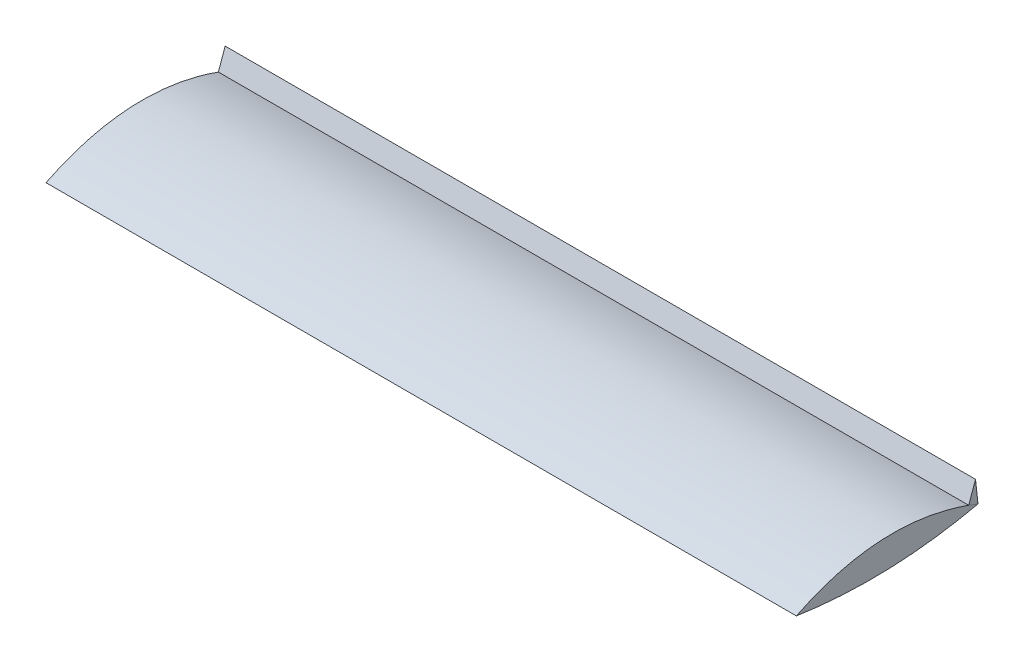
ISO-10303-21;
HEADER;
FILE_DESCRIPTION(('STEP AP214'),'2;1');
FILE_NAME('part.step','',(''),(''),'','','');
FILE_SCHEMA(('AUTOMOTIVE_DESIGN { 1 0 10303 214 1 1 1 1 }'));
ENDSEC;
DATA;
#1=APPLICATION_CONTEXT('core data for automotive mechanical design processes');
#2=APPLICATION_PROTOCOL_DEFINITION('international standard','automotive_design',2000,#1);
#3=PRODUCT_CONTEXT('',#1,'mechanical');
#4=PRODUCT('Part','Part','',(#3));
#5=PRODUCT_RELATED_PRODUCT_CATEGORY('part','',(#4));
#6=PRODUCT_DEFINITION_FORMATION('','',#4);
#7=PRODUCT_DEFINITION_CONTEXT('part definition',#1,'design');
#8=PRODUCT_DEFINITION('design','',#6,#7);
#9=PRODUCT_DEFINITION_SHAPE('','',#8);
#10=(LENGTH_UNIT() NAMED_UNIT(*) SI_UNIT(.MILLI.,.METRE.));
#11=(NAMED_UNIT(*) PLANE_ANGLE_UNIT() SI_UNIT($,.RADIAN.));
#12=(NAMED_UNIT(*) SI_UNIT($,.STERADIAN.) SOLID_ANGLE_UNIT());
#13=UNCERTAINTY_MEASURE_WITH_UNIT(LENGTH_MEASURE(1.E-05),#10,'distance_accuracy_value','');
#14=(GEOMETRIC_REPRESENTATION_CONTEXT(3) GLOBAL_UNCERTAINTY_ASSIGNED_CONTEXT((#13)) GLOBAL_UNIT_ASSIGNED_CONTEXT((#10,
#11,#12)) REPRESENTATION_CONTEXT('',''));
#15=CARTESIAN_POINT('',(0.,0.,0.));
#16=DIRECTION('',(0.,0.,1.));
#17=DIRECTION('',(1.,0.,0.));
#18=AXIS2_PLACEMENT_3D('',#15,#16,#17);
#19=CARTESIAN_POINT('',(1016.,-38.9625781669667,-109.160708675314));
#20=DIRECTION('',(0.,-0.336157423288673,-0.941805811602328));
#21=DIRECTION('',(0.,0.941805811602328,-0.336157423288673));
#22=AXIS2_PLACEMENT_3D('',#19,#20,#21);
#23=PLANE('',#22);
#24=DIRECTION('',(0.,-0.941805811602328,0.336157423288673));
#25=VECTOR('',#24,1.);
#26=CARTESIAN_POINT('',(0.,-38.9625781669667,-109.160708675314));
#27=LINE('',#26,#25);
#28=CARTESIAN_POINT('',(0.,17.8357986647974,-129.433673407036));
#29=VERTEX_POINT('',#28);
#30=CARTESIAN_POINT('',(0.,-8.00682593584594,-120.209701766865));
#31=VERTEX_POINT('',#30);
#32=EDGE_CURVE('E125',#29,#31,#27,.T.);
#33=ORIENTED_EDGE('',*,*,#32,.T.);
#34=DIRECTION('',(-1.,0.,0.));
#35=VECTOR('',#34,1.);
#36=CARTESIAN_POINT('',(1016.,-8.00682593584594,-120.209701766865));
#37=LINE('',#36,#35);
#38=CARTESIAN_POINT('',(1016.,-8.00682593584594,-120.209701766865));
#39=VERTEX_POINT('',#38);
#40=EDGE_CURVE('E13',#39,#31,#37,.T.);
#41=ORIENTED_EDGE('',*,*,#40,.F.);
#42=DIRECTION('',(0.,-0.941805811602328,0.336157423288673));
#43=VECTOR('',#42,1.);
#44=CARTESIAN_POINT('',(1016.,-38.9625781669667,-109.160708675314));
#45=LINE('',#44,#43);
#46=CARTESIAN_POINT('',(1016.,17.8357986647974,-129.433673407036));
#47=VERTEX_POINT('',#46);
#48=EDGE_CURVE('E118',#47,#39,#45,.T.);
#49=ORIENTED_EDGE('',*,*,#48,.F.);
#50=DIRECTION('',(-1.,0.,0.));
#51=VECTOR('',#50,1.);
#52=CARTESIAN_POINT('',(1016.,17.8357986647974,-129.433673407036));
#53=LINE('',#52,#51);
#54=EDGE_CURVE('E126',#47,#29,#53,.T.);
#55=ORIENTED_EDGE('',*,*,#54,.T.);
#56=EDGE_LOOP('',(#33,#41,#49,#55));
#57=FACE_BOUND('',#56,.T.);
#58=ADVANCED_FACE('F78',(#57),#23,.F.);
#59=CARTESIAN_POINT('',(1016.,-21.0675967965114,113.179157489608));
#60=CARTESIAN_POINT('',(1016.,37.8043897738782,-5.94556325268813));
#61=CARTESIAN_POINT('',(1016.,-12.7510064333488,-132.766638579989));
#62=B_SPLINE_CURVE_WITH_KNOTS('',2,(#59,#60,#61),.UNSPECIFIED.,.F.,.F.,(3,3),(0.,1.),.UNSPECIFIED.);
#63=DIRECTION('',(-1.,0.,0.));
#64=VECTOR('',#63,1.);
#65=SURFACE_OF_LINEAR_EXTRUSION('',#62,#64);
#66=CARTESIAN_POINT('',(0.,-21.0675967965114,113.179157489608));
#67=CARTESIAN_POINT('',(0.,37.8043897738782,-5.94556325268813));
#68=CARTESIAN_POINT('',(0.,-12.7510064333488,-132.766638579989));
#69=B_SPLINE_CURVE_WITH_KNOTS('',2,(#66,#67,#68),.UNSPECIFIED.,.F.,.F.,(3,3),(0.,1.),.UNSPECIFIED.);
#70=CARTESIAN_POINT('',(0.,-12.7510064333488,-132.766638579989));
#71=VERTEX_POINT('',#70);
#72=EDGE_CURVE('E106',#31,#71,#69,.T.);
#73=ORIENTED_EDGE('',*,*,#72,.T.);
#74=DIRECTION('',(-1.,0.,0.));
#75=VECTOR('',#74,1.);
#76=CARTESIAN_POINT('',(1016.,-12.7510064333488,-132.766638579989));
#77=LINE('',#76,#75);
#78=CARTESIAN_POINT('',(1016.,-12.7510064333488,-132.766638579989));
#79=VERTEX_POINT('',#78);
#80=EDGE_CURVE('E86',#79,#71,#77,.T.);
#81=ORIENTED_EDGE('',*,*,#80,.F.);
#82=EDGE_CURVE('E114',#39,#79,#62,.T.);
#83=ORIENTED_EDGE('',*,*,#82,.F.);
#84=ORIENTED_EDGE('',*,*,#40,.T.);
#85=EDGE_LOOP('',(#73,#81,#83,#84));
#86=FACE_BOUND('',#85,.T.);
#87=ADVANCED_FACE('F115',(#86),#65,.F.);
#88=CARTESIAN_POINT('',(1016.,14.1478435818485,-129.835540349708));
#89=DIRECTION('',(0.,-0.108326188676052,0.994115404189534));
#90=DIRECTION('',(0.,-0.994115404189534,-0.108326188676052));
#91=AXIS2_PLACEMENT_3D('',#88,#89,#90);
#92=PLANE('',#91);
#93=DIRECTION('',(0.,0.994115404189534,0.108326188676052));
#94=VECTOR('',#93,1.);
#95=CARTESIAN_POINT('',(0.,14.1478435818485,-129.835540349708));
#96=LINE('',#95,#94);
#97=EDGE_CURVE('E111',#71,#29,#96,.T.);
#98=ORIENTED_EDGE('',*,*,#97,.T.);
#99=ORIENTED_EDGE('',*,*,#54,.F.);
#100=DIRECTION('',(0.,0.994115404189534,0.108326188676052));
#101=VECTOR('',#100,1.);
#102=CARTESIAN_POINT('',(1016.,14.1478435818485,-129.835540349708));
#103=LINE('',#102,#101);
#104=EDGE_CURVE('E94',#79,#47,#103,.T.);
#105=ORIENTED_EDGE('',*,*,#104,.F.);
#106=ORIENTED_EDGE('',*,*,#80,.T.);
#107=EDGE_LOOP('',(#98,#99,#105,#106));
#108=FACE_BOUND('',#107,.T.);
#109=ADVANCED_FACE('F138',(#108),#92,.F.);
#110=CARTESIAN_POINT('',(1016.,0.,0.));
#111=DIRECTION('',(1.,0.,0.));
#112=DIRECTION('',(0.,0.,-1.));
#113=AXIS2_PLACEMENT_3D('',#110,#111,#112);
#114=PLANE('',#113);
#115=ORIENTED_EDGE('',*,*,#48,.T.);
#116=ORIENTED_EDGE('',*,*,#82,.T.);
#117=ORIENTED_EDGE('',*,*,#104,.T.);
#118=EDGE_LOOP('',(#115,#116,#117));
#119=FACE_BOUND('',#118,.T.);
#120=ADVANCED_FACE('F121',(#119),#114,.T.);
#121=CARTESIAN_POINT('',(0.,0.,0.));
#122=DIRECTION('',(1.,0.,0.));
#123=DIRECTION('',(0.,0.,-1.));
#124=AXIS2_PLACEMENT_3D('',#121,#122,#123);
#125=PLANE('',#124);
#126=ORIENTED_EDGE('',*,*,#32,.F.);
#127=ORIENTED_EDGE('',*,*,#97,.F.);
#128=ORIENTED_EDGE('',*,*,#72,.F.);
#129=EDGE_LOOP('',(#126,#127,#128));
#130=FACE_BOUND('',#129,.T.);
#131=ADVANCED_FACE('F139',(#130),#125,.F.);
#132=CLOSED_SHELL('',(#58,#87,#109,#120,#131));
#133=MANIFOLD_SOLID_BREP('B2',#132);
#134=CARTESIAN_POINT('',(1016.,-12.7510064333488,-132.766638579989));
#135=CARTESIAN_POINT('',(1016.,-39.9701870972654,-11.292482382107));
#136=CARTESIAN_POINT('',(1016.,-21.0675967965114,113.179157489608));
#137=B_SPLINE_CURVE_WITH_KNOTS('',2,(#134,#135,#136),.UNSPECIFIED.,.F.,.F.,(3,3),(0.,1.),.UNSPECIFIED.);
#138=DIRECTION('',(-1.,0.,0.));
#139=VECTOR('',#138,1.);
#140=SURFACE_OF_LINEAR_EXTRUSION('',#137,#139);
#141=CARTESIAN_POINT('',(0.,-12.7510064333488,-132.766638579989));
#142=CARTESIAN_POINT('',(0.,-39.9701870972654,-11.292482382107));
#143=CARTESIAN_POINT('',(0.,-21.0675967965114,113.179157489608));
#144=B_SPLINE_CURVE_WITH_KNOTS('',2,(#141,#142,#143),.UNSPECIFIED.,.F.,.F.,(3,3),(0.,1.),.UNSPECIFIED.);
#145=CARTESIAN_POINT('',(0.,-12.7510064333488,-132.766638579989));
#146=VERTEX_POINT('',#145);
#147=CARTESIAN_POINT('',(0.,-21.0675967965114,113.179157489608));
#148=VERTEX_POINT('',#147);
#149=EDGE_CURVE('E222',#146,#148,#144,.T.);
#150=ORIENTED_EDGE('',*,*,#149,.F.);
#151=DIRECTION('',(-1.,0.,0.));
#152=VECTOR('',#151,1.);
#153=CARTESIAN_POINT('',(1016.,-12.7510064333488,-132.766638579989));
#154=LINE('',#153,#152);
#155=CARTESIAN_POINT('',(1016.,-12.7510064333488,-132.766638579989));
#156=VERTEX_POINT('',#155);
#157=EDGE_CURVE('E76',#156,#146,#154,.T.);
#158=ORIENTED_EDGE('',*,*,#157,.F.);
#159=CARTESIAN_POINT('',(1016.,-21.0675967965114,113.179157489608));
#160=VERTEX_POINT('',#159);
#161=EDGE_CURVE('E220',#156,#160,#137,.T.);
#162=ORIENTED_EDGE('',*,*,#161,.T.);
#163=DIRECTION('',(-1.,0.,0.));
#164=VECTOR('',#163,1.);
#165=CARTESIAN_POINT('',(1016.,-21.0675967965114,113.179157489608));
#166=LINE('',#165,#164);
#167=EDGE_CURVE('E204',#160,#148,#166,.T.);
#168=ORIENTED_EDGE('',*,*,#167,.T.);
#169=EDGE_LOOP('',(#150,#158,#162,#168));
#170=FACE_BOUND('',#169,.T.);
#171=ADVANCED_FACE('F187',(#170),#140,.T.);
#172=CARTESIAN_POINT('',(1016.,32.7370395573415,-12.3684961488052));
#173=DIRECTION('',(0.,0.93546103957566,-0.353429828163987));
#174=DIRECTION('',(0.,0.353429828163987,0.93546103957566));
#175=AXIS2_PLACEMENT_3D('',#172,#173,#174);
#176=PLANE('',#175);
#177=DIRECTION('',(0.,-0.353429828163987,-0.93546103957566));
#178=VECTOR('',#177,1.);
#179=CARTESIAN_POINT('',(0.,32.7370395573415,-12.3684961488052));
#180=LINE('',#179,#178);
#181=CARTESIAN_POINT('',(0.,-8.00682593584594,-120.209701766865));
#182=VERTEX_POINT('',#181);
#183=EDGE_CURVE('E290',#182,#146,#180,.T.);
#184=ORIENTED_EDGE('',*,*,#183,.F.);
#185=DIRECTION('',(-1.,0.,0.));
#186=VECTOR('',#185,1.);
#187=CARTESIAN_POINT('',(1016.,-8.00682593584594,-120.209701766865));
#188=LINE('',#187,#186);
#189=CARTESIAN_POINT('',(1016.,-8.00682593584594,-120.209701766865));
#190=VERTEX_POINT('',#189);
#191=EDGE_CURVE('E196',#190,#182,#188,.T.);
#192=ORIENTED_EDGE('',*,*,#191,.F.);
#193=DIRECTION('',(0.,-0.353429828163987,-0.93546103957566));
#194=VECTOR('',#193,1.);
#195=CARTESIAN_POINT('',(1016.,32.7370395573415,-12.3684961488052));
#196=LINE('',#195,#194);
#197=EDGE_CURVE('E229',#190,#156,#196,.T.);
#198=ORIENTED_EDGE('',*,*,#197,.T.);
#199=ORIENTED_EDGE('',*,*,#157,.T.);
#200=EDGE_LOOP('',(#184,#192,#198,#199));
#201=FACE_BOUND('',#200,.T.);
#202=ADVANCED_FACE('F232',(#201),#176,.T.);
#203=CARTESIAN_POINT('',(1016.,-21.0675967965114,113.179157489608));
#204=CARTESIAN_POINT('',(1016.,37.8043897738782,-5.94556325268813));
#205=CARTESIAN_POINT('',(1016.,-12.7510064333488,-132.766638579989));
#206=B_SPLINE_CURVE_WITH_KNOTS('',2,(#203,#204,#205),.UNSPECIFIED.,.F.,.F.,(3,3),(0.,1.),.UNSPECIFIED.);
#207=DIRECTION('',(-1.,0.,0.));
#208=VECTOR('',#207,1.);
#209=SURFACE_OF_LINEAR_EXTRUSION('',#206,#208);
#210=CARTESIAN_POINT('',(0.,-21.0675967965114,113.179157489608));
#211=CARTESIAN_POINT('',(0.,37.8043897738782,-5.94556325268813));
#212=CARTESIAN_POINT('',(0.,-12.7510064333488,-132.766638579989));
#213=B_SPLINE_CURVE_WITH_KNOTS('',2,(#210,#211,#212),.UNSPECIFIED.,.F.,.F.,(3,3),(0.,1.),.UNSPECIFIED.);
#214=EDGE_CURVE('E231',#148,#182,#213,.T.);
#215=ORIENTED_EDGE('',*,*,#214,.F.);
#216=ORIENTED_EDGE('',*,*,#167,.F.);
#217=EDGE_CURVE('E230',#160,#190,#206,.T.);
#218=ORIENTED_EDGE('',*,*,#217,.T.);
#219=ORIENTED_EDGE('',*,*,#191,.T.);
#220=EDGE_LOOP('',(#215,#216,#218,#219));
#221=FACE_BOUND('',#220,.T.);
#222=ADVANCED_FACE('F249',(#221),#209,.T.);
#223=CARTESIAN_POINT('',(1016.,0.,0.));
#224=DIRECTION('',(1.,0.,0.));
#225=DIRECTION('',(0.,0.,-1.));
#226=AXIS2_PLACEMENT_3D('',#223,#224,#225);
#227=PLANE('',#226);
#228=ORIENTED_EDGE('',*,*,#161,.F.);
#229=ORIENTED_EDGE('',*,*,#197,.F.);
#230=ORIENTED_EDGE('',*,*,#217,.F.);
#231=EDGE_LOOP('',(#228,#229,#230));
#232=FACE_BOUND('',#231,.T.);
#233=ADVANCED_FACE('F228',(#232),#227,.T.);
#234=CARTESIAN_POINT('',(0.,0.,0.));
#235=DIRECTION('',(1.,0.,0.));
#236=DIRECTION('',(0.,0.,-1.));
#237=AXIS2_PLACEMENT_3D('',#234,#235,#236);
#238=PLANE('',#237);
#239=ORIENTED_EDGE('',*,*,#149,.T.);
#240=ORIENTED_EDGE('',*,*,#214,.T.);
#241=ORIENTED_EDGE('',*,*,#183,.T.);
#242=EDGE_LOOP('',(#239,#240,#241));
#243=FACE_BOUND('',#242,.T.);
#244=ADVANCED_FACE('F252',(#243),#238,.F.);
#245=CLOSED_SHELL('',(#171,#202,#222,#233,#244));
#246=MANIFOLD_SOLID_BREP('B7',#245);
#247=ADVANCED_BREP_SHAPE_REPRESENTATION('',(#18,#133,#246),#14);
#248=SHAPE_DEFINITION_REPRESENTATION(#9,#247);
ENDSEC;
END-ISO-10303-21;
